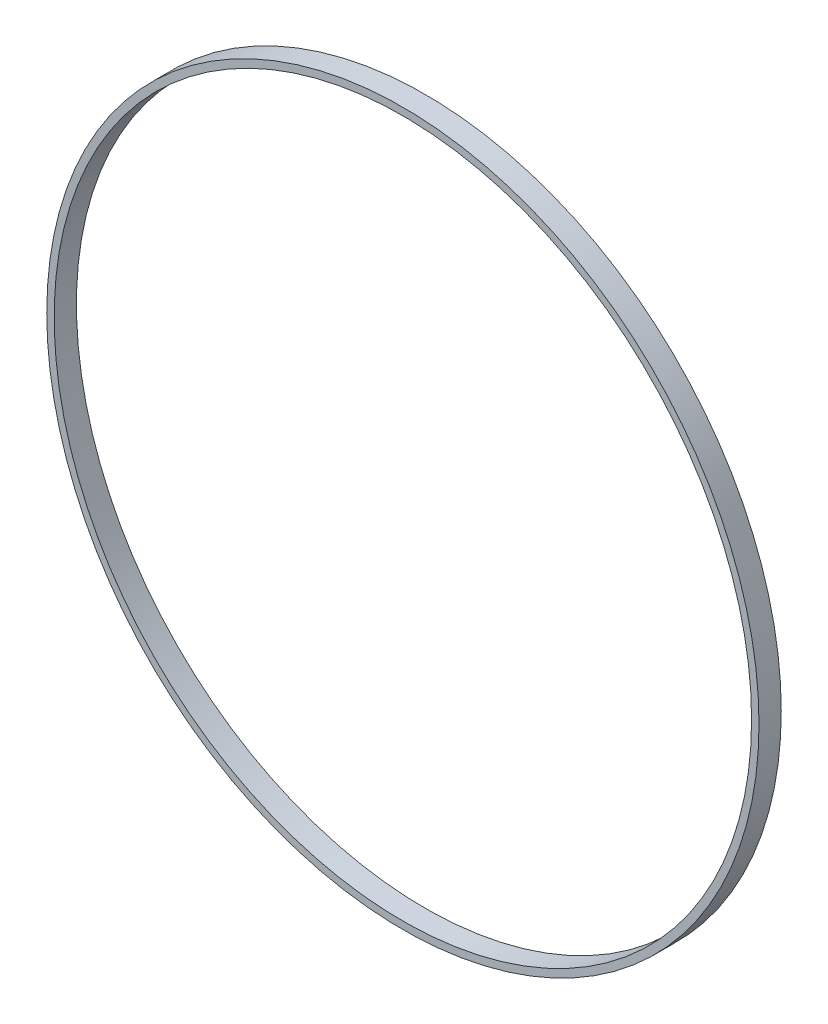
ISO-10303-21;
HEADER;
FILE_DESCRIPTION(('STEP AP214'),'2;1');
FILE_NAME('part.step','',(''),(''),'','','');
FILE_SCHEMA(('AUTOMOTIVE_DESIGN { 1 0 10303 214 1 1 1 1 }'));
ENDSEC;
DATA;
#1=APPLICATION_CONTEXT('core data for automotive mechanical design processes');
#2=APPLICATION_PROTOCOL_DEFINITION('international standard','automotive_design',2000,#1);
#3=PRODUCT_CONTEXT('',#1,'mechanical');
#4=PRODUCT('Part','Part','',(#3));
#5=PRODUCT_RELATED_PRODUCT_CATEGORY('part','',(#4));
#6=PRODUCT_DEFINITION_FORMATION('','',#4);
#7=PRODUCT_DEFINITION_CONTEXT('part definition',#1,'design');
#8=PRODUCT_DEFINITION('design','',#6,#7);
#9=PRODUCT_DEFINITION_SHAPE('','',#8);
#10=(LENGTH_UNIT() NAMED_UNIT(*) SI_UNIT(.MILLI.,.METRE.));
#11=(NAMED_UNIT(*) PLANE_ANGLE_UNIT() SI_UNIT($,.RADIAN.));
#12=(NAMED_UNIT(*) SI_UNIT($,.STERADIAN.) SOLID_ANGLE_UNIT());
#13=UNCERTAINTY_MEASURE_WITH_UNIT(LENGTH_MEASURE(1.E-05),#10,'distance_accuracy_value','');
#14=(GEOMETRIC_REPRESENTATION_CONTEXT(3) GLOBAL_UNCERTAINTY_ASSIGNED_CONTEXT((#13)) GLOBAL_UNIT_ASSIGNED_CONTEXT((#10,
#11,#12)) REPRESENTATION_CONTEXT('',''));
#15=CARTESIAN_POINT('',(0.,0.,0.));
#16=DIRECTION('',(0.,0.,1.));
#17=DIRECTION('',(1.,0.,0.));
#18=AXIS2_PLACEMENT_3D('',#15,#16,#17);
#19=CARTESIAN_POINT('',(0.,0.,7.5));
#20=DIRECTION('',(0.,0.,1.));
#21=DIRECTION('',(1.,0.,0.));
#22=AXIS2_PLACEMENT_3D('',#19,#20,#21);
#23=PLANE('',#22);
#24=CARTESIAN_POINT('',(0.,0.,7.5));
#25=DIRECTION('',(0.,0.,1.));
#26=DIRECTION('',(1.,0.,0.));
#27=AXIS2_PLACEMENT_3D('',#24,#25,#26);
#28=CIRCLE('',#27,120.);
#29=CARTESIAN_POINT('',(120.,0.,7.5));
#30=VERTEX_POINT('',#29);
#31=EDGE_CURVE('E10',#30,#30,#28,.T.);
#32=ORIENTED_EDGE('',*,*,#31,.T.);
#33=EDGE_LOOP('',(#32));
#34=FACE_BOUND('',#33,.T.);
#35=CARTESIAN_POINT('',(0.,0.,7.5));
#36=DIRECTION('',(0.,0.,1.));
#37=DIRECTION('',(1.,0.,0.));
#38=AXIS2_PLACEMENT_3D('',#35,#36,#37);
#39=CIRCLE('',#38,117.5);
#40=CARTESIAN_POINT('',(117.5,0.,7.5));
#41=VERTEX_POINT('',#40);
#42=EDGE_CURVE('E50',#41,#41,#39,.T.);
#43=ORIENTED_EDGE('',*,*,#42,.F.);
#44=EDGE_LOOP('',(#43));
#45=FACE_BOUND('',#44,.T.);
#46=ADVANCED_FACE('F37',(#34,#45),#23,.T.);
#47=CARTESIAN_POINT('',(0.,0.,0.));
#48=DIRECTION('',(0.,0.,1.));
#49=DIRECTION('',(1.,0.,0.));
#50=AXIS2_PLACEMENT_3D('',#47,#48,#49);
#51=PLANE('',#50);
#52=CARTESIAN_POINT('',(0.,0.,0.));
#53=DIRECTION('',(0.,0.,1.));
#54=DIRECTION('',(1.,0.,0.));
#55=AXIS2_PLACEMENT_3D('',#52,#53,#54);
#56=CIRCLE('',#55,120.);
#57=CARTESIAN_POINT('',(120.,0.,0.));
#58=VERTEX_POINT('',#57);
#59=EDGE_CURVE('E41',#58,#58,#56,.T.);
#60=ORIENTED_EDGE('',*,*,#59,.F.);
#61=EDGE_LOOP('',(#60));
#62=FACE_BOUND('',#61,.T.);
#63=CARTESIAN_POINT('',(0.,0.,0.));
#64=DIRECTION('',(0.,0.,1.));
#65=DIRECTION('',(1.,0.,0.));
#66=AXIS2_PLACEMENT_3D('',#63,#64,#65);
#67=CIRCLE('',#66,117.5);
#68=CARTESIAN_POINT('',(117.5,0.,0.));
#69=VERTEX_POINT('',#68);
#70=EDGE_CURVE('E52',#69,#69,#67,.T.);
#71=ORIENTED_EDGE('',*,*,#70,.T.);
#72=EDGE_LOOP('',(#71));
#73=FACE_BOUND('',#72,.T.);
#74=ADVANCED_FACE('F64',(#62,#73),#51,.F.);
#75=CARTESIAN_POINT('',(0.,0.,7.5));
#76=DIRECTION('',(0.,0.,-1.));
#77=DIRECTION('',(-1.,0.,0.));
#78=AXIS2_PLACEMENT_3D('',#75,#76,#77);
#79=CYLINDRICAL_SURFACE('',#78,120.);
#80=ORIENTED_EDGE('',*,*,#31,.F.);
#81=EDGE_LOOP('',(#80));
#82=FACE_BOUND('',#81,.T.);
#83=ORIENTED_EDGE('',*,*,#59,.T.);
#84=EDGE_LOOP('',(#83));
#85=FACE_BOUND('',#84,.T.);
#86=ADVANCED_FACE('F39',(#82,#85),#79,.T.);
#87=CARTESIAN_POINT('',(0.,0.,7.5));
#88=DIRECTION('',(0.,0.,-1.));
#89=DIRECTION('',(-1.,0.,0.));
#90=AXIS2_PLACEMENT_3D('',#87,#88,#89);
#91=CYLINDRICAL_SURFACE('',#90,117.5);
#92=ORIENTED_EDGE('',*,*,#42,.T.);
#93=EDGE_LOOP('',(#92));
#94=FACE_BOUND('',#93,.T.);
#95=ORIENTED_EDGE('',*,*,#70,.F.);
#96=EDGE_LOOP('',(#95));
#97=FACE_BOUND('',#96,.T.);
#98=ADVANCED_FACE('F60',(#94,#97),#91,.F.);
#99=CLOSED_SHELL('',(#46,#74,#86,#98));
#100=MANIFOLD_SOLID_BREP('B2',#99);
#101=ADVANCED_BREP_SHAPE_REPRESENTATION('',(#18,#100),#14);
#102=SHAPE_DEFINITION_REPRESENTATION(#9,#101);
ENDSEC;
END-ISO-10303-21;
